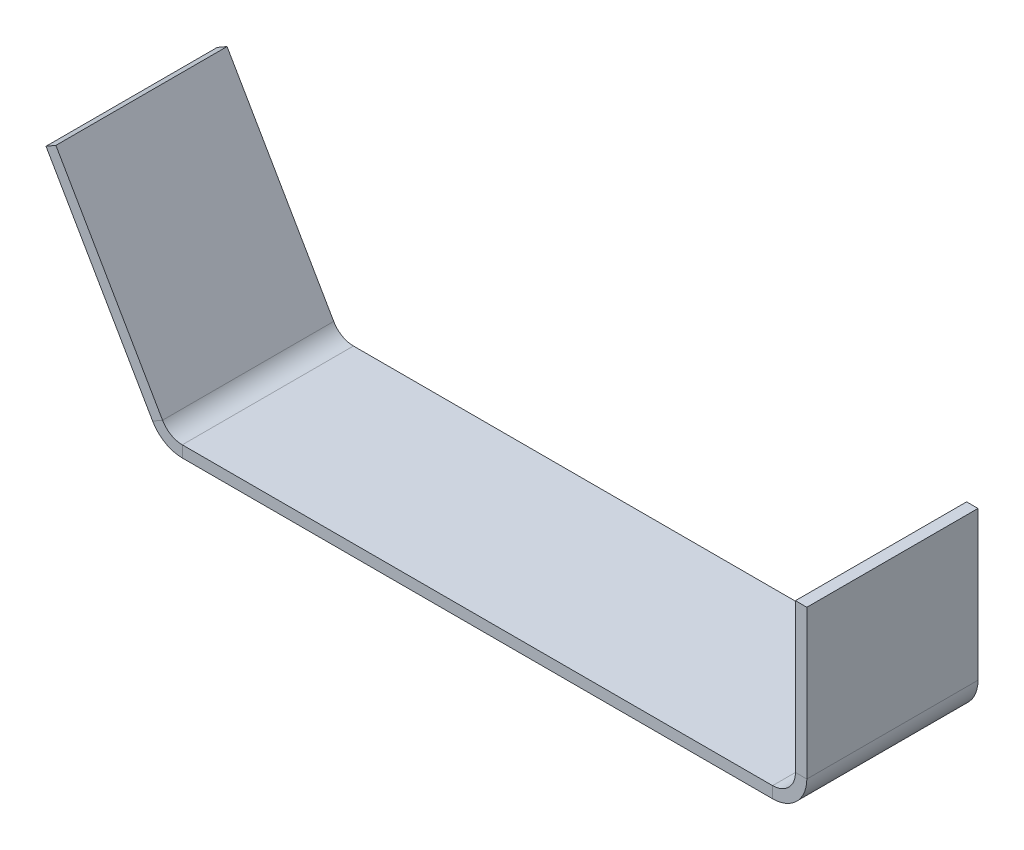
ISO-10303-21;
HEADER;
FILE_DESCRIPTION(('STEP AP214'),'2;1');
FILE_NAME('part.step','',(''),(''),'','','');
FILE_SCHEMA(('AUTOMOTIVE_DESIGN { 1 0 10303 214 1 1 1 1 }'));
ENDSEC;
DATA;
#1=APPLICATION_CONTEXT('core data for automotive mechanical design processes');
#2=APPLICATION_PROTOCOL_DEFINITION('international standard','automotive_design',2000,#1);
#3=PRODUCT_CONTEXT('',#1,'mechanical');
#4=PRODUCT('Part','Part','',(#3));
#5=PRODUCT_RELATED_PRODUCT_CATEGORY('part','',(#4));
#6=PRODUCT_DEFINITION_FORMATION('','',#4);
#7=PRODUCT_DEFINITION_CONTEXT('part definition',#1,'design');
#8=PRODUCT_DEFINITION('design','',#6,#7);
#9=PRODUCT_DEFINITION_SHAPE('','',#8);
#10=(LENGTH_UNIT() NAMED_UNIT(*) SI_UNIT(.MILLI.,.METRE.));
#11=(NAMED_UNIT(*) PLANE_ANGLE_UNIT() SI_UNIT($,.RADIAN.));
#12=(NAMED_UNIT(*) SI_UNIT($,.STERADIAN.) SOLID_ANGLE_UNIT());
#13=UNCERTAINTY_MEASURE_WITH_UNIT(LENGTH_MEASURE(1.E-05),#10,'distance_accuracy_value','');
#14=(GEOMETRIC_REPRESENTATION_CONTEXT(3) GLOBAL_UNCERTAINTY_ASSIGNED_CONTEXT((#13)) GLOBAL_UNIT_ASSIGNED_CONTEXT((#10,
#11,#12)) REPRESENTATION_CONTEXT('',''));
#15=CARTESIAN_POINT('',(0.,0.,0.));
#16=DIRECTION('',(0.,0.,1.));
#17=DIRECTION('',(1.,0.,0.));
#18=AXIS2_PLACEMENT_3D('',#15,#16,#17);
#19=CARTESIAN_POINT('',(0.,1.,0.));
#20=DIRECTION('',(0.,1.,0.));
#21=DIRECTION('',(0.,0.,1.));
#22=AXIS2_PLACEMENT_3D('',#19,#20,#21);
#23=PLANE('',#22);
#24=DIRECTION('',(1.,0.,0.));
#25=VECTOR('',#24,1.);
#26=CARTESIAN_POINT('',(-45.,1.,7.5));
#27=LINE('',#26,#25);
#28=CARTESIAN_POINT('',(-23.6910030610043,1.,7.5));
#29=VERTEX_POINT('',#28);
#30=CARTESIAN_POINT('',(28.0365045915063,1.,7.5));
#31=VERTEX_POINT('',#30);
#32=EDGE_CURVE('E53',#29,#31,#27,.T.);
#33=ORIENTED_EDGE('',*,*,#32,.T.);
#34=DIRECTION('',(0.,0.,-1.));
#35=VECTOR('',#34,1.);
#36=CARTESIAN_POINT('',(28.0365045915064,1.,0.));
#37=LINE('',#36,#35);
#38=CARTESIAN_POINT('',(28.0365045915063,1.,-7.5));
#39=VERTEX_POINT('',#38);
#40=EDGE_CURVE('E241',#31,#39,#37,.T.);
#41=ORIENTED_EDGE('',*,*,#40,.T.);
#42=DIRECTION('',(-1.,0.,0.));
#43=VECTOR('',#42,1.);
#44=CARTESIAN_POINT('',(-45.,1.,-7.5));
#45=LINE('',#44,#43);
#46=CARTESIAN_POINT('',(-23.6910030610042,1.,-7.5));
#47=VERTEX_POINT('',#46);
#48=EDGE_CURVE('E215',#39,#47,#45,.T.);
#49=ORIENTED_EDGE('',*,*,#48,.T.);
#50=DIRECTION('',(0.,0.,-1.));
#51=VECTOR('',#50,1.);
#52=CARTESIAN_POINT('',(-23.6910030610042,1.,0.));
#53=LINE('',#52,#51);
#54=EDGE_CURVE('E203',#29,#47,#53,.T.);
#55=ORIENTED_EDGE('',*,*,#54,.F.);
#56=EDGE_LOOP('',(#33,#41,#49,#55));
#57=FACE_BOUND('',#56,.T.);
#58=ADVANCED_FACE('F49',(#57),#23,.T.);
#59=CARTESIAN_POINT('',(-12.2685553990753,-20.7842596972574,0.));
#60=DIRECTION('',(0.86602540378444,0.499999999999998,0.));
#61=DIRECTION('',(0.,0.,1.));
#62=AXIS2_PLACEMENT_3D('',#59,#60,#61);
#63=PLANE('',#62);
#64=DIRECTION('',(0.499999999999998,-0.86602540378444,0.));
#65=VECTOR('',#64,1.);
#66=CARTESIAN_POINT('',(-34.7685553990752,18.1868834730424,7.5));
#67=LINE('',#66,#65);
#68=CARTESIAN_POINT('',(-34.7685553990752,18.1868834730424,7.5));
#69=VERTEX_POINT('',#68);
#70=CARTESIAN_POINT('',(-25.4230538685731,2.00000000000001,7.5));
#71=VERTEX_POINT('',#70);
#72=EDGE_CURVE('E220',#69,#71,#67,.T.);
#73=ORIENTED_EDGE('',*,*,#72,.T.);
#74=DIRECTION('',(0.,0.,-1.));
#75=VECTOR('',#74,1.);
#76=CARTESIAN_POINT('',(-25.4230538685731,2.,0.));
#77=LINE('',#76,#75);
#78=CARTESIAN_POINT('',(-25.4230538685731,2.00000000000001,-7.5));
#79=VERTEX_POINT('',#78);
#80=EDGE_CURVE('E231',#71,#79,#77,.T.);
#81=ORIENTED_EDGE('',*,*,#80,.T.);
#82=DIRECTION('',(-0.499999999999998,0.86602540378444,0.));
#83=VECTOR('',#82,1.);
#84=CARTESIAN_POINT('',(-34.7685553990752,18.1868834730424,-7.5));
#85=LINE('',#84,#83);
#86=CARTESIAN_POINT('',(-34.7685553990752,18.1868834730424,-7.5));
#87=VERTEX_POINT('',#86);
#88=EDGE_CURVE('E221',#79,#87,#85,.T.);
#89=ORIENTED_EDGE('',*,*,#88,.T.);
#90=DIRECTION('',(0.,0.,1.));
#91=VECTOR('',#90,1.);
#92=CARTESIAN_POINT('',(-34.7685553990752,18.1868834730424,-7.5));
#93=LINE('',#92,#91);
#94=EDGE_CURVE('E218',#87,#69,#93,.T.);
#95=ORIENTED_EDGE('',*,*,#94,.T.);
#96=EDGE_LOOP('',(#73,#81,#89,#95));
#97=FACE_BOUND('',#96,.T.);
#98=ADVANCED_FACE('F292',(#97),#63,.T.);
#99=CARTESIAN_POINT('',(-34.7685553990752,18.1868834730424,-7.5));
#100=DIRECTION('',(0.,0.,1.));
#101=DIRECTION('',(0.499999999999998,-0.86602540378444,0.));
#102=AXIS2_PLACEMENT_3D('',#99,#100,#101);
#103=PLANE('',#102);
#104=DIRECTION('',(0.86602540378444,0.499999999999998,0.));
#105=VECTOR('',#104,1.);
#106=CARTESIAN_POINT('',(-25.4230538685731,2.,-7.5));
#107=LINE('',#106,#105);
#108=CARTESIAN_POINT('',(-26.2890792723576,1.50000000000001,-7.5));
#109=VERTEX_POINT('',#108);
#110=EDGE_CURVE('E238',#109,#79,#107,.T.);
#111=ORIENTED_EDGE('',*,*,#110,.F.);
#112=DIRECTION('',(-0.499999999999998,0.86602540378444,0.));
#113=VECTOR('',#112,1.);
#114=CARTESIAN_POINT('',(-35.6345808028597,17.6868834730424,-7.5));
#115=LINE('',#114,#113);
#116=CARTESIAN_POINT('',(-35.6345808028597,17.6868834730424,-7.5));
#117=VERTEX_POINT('',#116);
#118=EDGE_CURVE('E210',#109,#117,#115,.T.);
#119=ORIENTED_EDGE('',*,*,#118,.T.);
#120=DIRECTION('',(-0.86602540378444,-0.499999999999998,0.));
#121=VECTOR('',#120,1.);
#122=CARTESIAN_POINT('',(-34.7685553990752,18.1868834730424,-7.5));
#123=LINE('',#122,#121);
#124=EDGE_CURVE('E228',#87,#117,#123,.T.);
#125=ORIENTED_EDGE('',*,*,#124,.F.);
#126=ORIENTED_EDGE('',*,*,#88,.F.);
#127=EDGE_LOOP('',(#111,#119,#125,#126));
#128=FACE_BOUND('',#127,.T.);
#129=ADVANCED_FACE('F298',(#128),#103,.F.);
#130=CARTESIAN_POINT('',(-34.7685553990752,18.1868834730424,-7.5));
#131=DIRECTION('',(0.499999999999998,-0.86602540378444,0.));
#132=DIRECTION('',(0.,0.,-1.));
#133=AXIS2_PLACEMENT_3D('',#130,#131,#132);
#134=PLANE('',#133);
#135=DIRECTION('',(0.,0.,1.));
#136=VECTOR('',#135,1.);
#137=CARTESIAN_POINT('',(-35.6345808028597,17.6868834730424,-7.5));
#138=LINE('',#137,#136);
#139=CARTESIAN_POINT('',(-35.6345808028597,17.6868834730424,7.5));
#140=VERTEX_POINT('',#139);
#141=EDGE_CURVE('E222',#117,#140,#138,.T.);
#142=ORIENTED_EDGE('',*,*,#141,.T.);
#143=DIRECTION('',(-0.86602540378444,-0.499999999999998,0.));
#144=VECTOR('',#143,1.);
#145=CARTESIAN_POINT('',(-34.7685553990752,18.1868834730424,7.5));
#146=LINE('',#145,#144);
#147=EDGE_CURVE('E225',#69,#140,#146,.T.);
#148=ORIENTED_EDGE('',*,*,#147,.F.);
#149=ORIENTED_EDGE('',*,*,#94,.F.);
#150=ORIENTED_EDGE('',*,*,#124,.T.);
#151=EDGE_LOOP('',(#142,#148,#149,#150));
#152=FACE_BOUND('',#151,.T.);
#153=ADVANCED_FACE('F304',(#152),#134,.F.);
#154=CARTESIAN_POINT('',(-34.7685553990752,18.1868834730424,7.5));
#155=DIRECTION('',(0.,0.,-1.));
#156=DIRECTION('',(-0.499999999999998,0.86602540378444,0.));
#157=AXIS2_PLACEMENT_3D('',#154,#155,#156);
#158=PLANE('',#157);
#159=DIRECTION('',(-0.86602540378444,-0.499999999999998,0.));
#160=VECTOR('',#159,1.);
#161=CARTESIAN_POINT('',(-25.4230538685731,2.,7.5));
#162=LINE('',#161,#160);
#163=CARTESIAN_POINT('',(-26.2890792723576,1.50000000000001,7.5));
#164=VERTEX_POINT('',#163);
#165=EDGE_CURVE('E234',#71,#164,#162,.T.);
#166=ORIENTED_EDGE('',*,*,#165,.F.);
#167=ORIENTED_EDGE('',*,*,#72,.F.);
#168=ORIENTED_EDGE('',*,*,#147,.T.);
#169=DIRECTION('',(0.499999999999998,-0.86602540378444,0.));
#170=VECTOR('',#169,1.);
#171=CARTESIAN_POINT('',(-35.6345808028597,17.6868834730424,7.5));
#172=LINE('',#171,#170);
#173=EDGE_CURVE('E224',#140,#164,#172,.T.);
#174=ORIENTED_EDGE('',*,*,#173,.T.);
#175=EDGE_LOOP('',(#166,#167,#168,#174));
#176=FACE_BOUND('',#175,.T.);
#177=ADVANCED_FACE('F307',(#176),#158,.F.);
#178=CARTESIAN_POINT('',(-13.1345808028597,-21.2842596972574,0.));
#179=DIRECTION('',(0.86602540378444,0.499999999999998,0.));
#180=DIRECTION('',(0.,0.,1.));
#181=AXIS2_PLACEMENT_3D('',#178,#179,#180);
#182=PLANE('',#181);
#183=DIRECTION('',(0.,0.,-1.));
#184=VECTOR('',#183,1.);
#185=CARTESIAN_POINT('',(-26.2890792723576,1.5,0.));
#186=LINE('',#185,#184);
#187=EDGE_CURVE('E236',#164,#109,#186,.T.);
#188=ORIENTED_EDGE('',*,*,#187,.F.);
#189=ORIENTED_EDGE('',*,*,#173,.F.);
#190=ORIENTED_EDGE('',*,*,#141,.F.);
#191=ORIENTED_EDGE('',*,*,#118,.F.);
#192=EDGE_LOOP('',(#188,#189,#190,#191));
#193=FACE_BOUND('',#192,.T.);
#194=ADVANCED_FACE('F315',(#193),#182,.F.);
#195=CARTESIAN_POINT('',(-45.,1.,7.5));
#196=DIRECTION('',(0.,0.,-1.));
#197=DIRECTION('',(-1.,0.,0.));
#198=AXIS2_PLACEMENT_3D('',#195,#196,#197);
#199=PLANE('',#198);
#200=DIRECTION('',(0.,-1.,0.));
#201=VECTOR('',#200,1.);
#202=CARTESIAN_POINT('',(28.0365045915064,1.,7.5));
#203=LINE('',#202,#201);
#204=CARTESIAN_POINT('',(28.0365045915063,0.,7.5));
#205=VERTEX_POINT('',#204);
#206=EDGE_CURVE('E250',#31,#205,#203,.T.);
#207=ORIENTED_EDGE('',*,*,#206,.F.);
#208=ORIENTED_EDGE('',*,*,#32,.F.);
#209=DIRECTION('',(0.,-1.,0.));
#210=VECTOR('',#209,1.);
#211=CARTESIAN_POINT('',(-23.6910030610042,1.,7.5));
#212=LINE('',#211,#210);
#213=CARTESIAN_POINT('',(-23.6910030610043,0.,7.5));
#214=VERTEX_POINT('',#213);
#215=EDGE_CURVE('E213',#29,#214,#212,.T.);
#216=ORIENTED_EDGE('',*,*,#215,.T.);
#217=DIRECTION('',(1.,0.,0.));
#218=VECTOR('',#217,1.);
#219=CARTESIAN_POINT('',(-45.,0.,7.5));
#220=LINE('',#219,#218);
#221=EDGE_CURVE('E74',#214,#205,#220,.T.);
#222=ORIENTED_EDGE('',*,*,#221,.T.);
#223=EDGE_LOOP('',(#207,#208,#216,#222));
#224=FACE_BOUND('',#223,.T.);
#225=ADVANCED_FACE('F260',(#224),#199,.F.);
#226=CARTESIAN_POINT('',(0.,0.,0.));
#227=DIRECTION('',(0.,1.,0.));
#228=DIRECTION('',(0.,0.,1.));
#229=AXIS2_PLACEMENT_3D('',#226,#227,#228);
#230=PLANE('',#229);
#231=DIRECTION('',(0.,0.,-1.));
#232=VECTOR('',#231,1.);
#233=CARTESIAN_POINT('',(28.0365045915064,0.,0.));
#234=LINE('',#233,#232);
#235=CARTESIAN_POINT('',(28.0365045915063,0.,-7.5));
#236=VERTEX_POINT('',#235);
#237=EDGE_CURVE('E58',#205,#236,#234,.T.);
#238=ORIENTED_EDGE('',*,*,#237,.F.);
#239=ORIENTED_EDGE('',*,*,#221,.F.);
#240=DIRECTION('',(0.,0.,-1.));
#241=VECTOR('',#240,1.);
#242=CARTESIAN_POINT('',(-23.6910030610042,0.,0.));
#243=LINE('',#242,#241);
#244=CARTESIAN_POINT('',(-23.6910030610043,0.,-7.5));
#245=VERTEX_POINT('',#244);
#246=EDGE_CURVE('E211',#214,#245,#243,.T.);
#247=ORIENTED_EDGE('',*,*,#246,.T.);
#248=DIRECTION('',(-1.,0.,0.));
#249=VECTOR('',#248,1.);
#250=CARTESIAN_POINT('',(-45.,0.,-7.5));
#251=LINE('',#250,#249);
#252=EDGE_CURVE('E66',#236,#245,#251,.T.);
#253=ORIENTED_EDGE('',*,*,#252,.F.);
#254=EDGE_LOOP('',(#238,#239,#247,#253));
#255=FACE_BOUND('',#254,.T.);
#256=ADVANCED_FACE('F281',(#255),#230,.F.);
#257=CARTESIAN_POINT('',(-45.,1.,-7.5));
#258=DIRECTION('',(0.,0.,1.));
#259=DIRECTION('',(1.,0.,0.));
#260=AXIS2_PLACEMENT_3D('',#257,#258,#259);
#261=PLANE('',#260);
#262=DIRECTION('',(0.,1.,0.));
#263=VECTOR('',#262,1.);
#264=CARTESIAN_POINT('',(28.0365045915064,1.,-7.5));
#265=LINE('',#264,#263);
#266=EDGE_CURVE('E12',#236,#39,#265,.T.);
#267=ORIENTED_EDGE('',*,*,#266,.F.);
#268=ORIENTED_EDGE('',*,*,#252,.T.);
#269=DIRECTION('',(0.,1.,0.));
#270=VECTOR('',#269,1.);
#271=CARTESIAN_POINT('',(-23.6910030610042,1.,-7.5));
#272=LINE('',#271,#270);
#273=EDGE_CURVE('E207',#245,#47,#272,.T.);
#274=ORIENTED_EDGE('',*,*,#273,.T.);
#275=ORIENTED_EDGE('',*,*,#48,.F.);
#276=EDGE_LOOP('',(#267,#268,#274,#275));
#277=FACE_BOUND('',#276,.T.);
#278=ADVANCED_FACE('F51',(#277),#261,.F.);
#279=CARTESIAN_POINT('',(-23.6910030610042,3.,7.5));
#280=DIRECTION('',(0.,0.,-1.));
#281=DIRECTION('',(-1.,0.,0.));
#282=AXIS2_PLACEMENT_3D('',#279,#280,#281);
#283=PLANE('',#282);
#284=ORIENTED_EDGE('',*,*,#165,.T.);
#285=CARTESIAN_POINT('',(-23.6910030610042,3.,7.5));
#286=DIRECTION('',(0.,0.,1.));
#287=DIRECTION('',(1.,0.,0.));
#288=AXIS2_PLACEMENT_3D('',#285,#286,#287);
#289=CIRCLE('',#288,3.);
#290=EDGE_CURVE('E193',#164,#214,#289,.T.);
#291=ORIENTED_EDGE('',*,*,#290,.T.);
#292=ORIENTED_EDGE('',*,*,#215,.F.);
#293=CARTESIAN_POINT('',(-23.6910030610042,3.,7.5));
#294=DIRECTION('',(0.,0.,1.));
#295=DIRECTION('',(1.,0.,0.));
#296=AXIS2_PLACEMENT_3D('',#293,#294,#295);
#297=CIRCLE('',#296,2.);
#298=EDGE_CURVE('E197',#71,#29,#297,.T.);
#299=ORIENTED_EDGE('',*,*,#298,.F.);
#300=EDGE_LOOP('',(#284,#291,#292,#299));
#301=FACE_BOUND('',#300,.T.);
#302=ADVANCED_FACE('F285',(#301),#283,.F.);
#303=CARTESIAN_POINT('',(-23.6910030610042,3.,-7.5));
#304=DIRECTION('',(0.,0.,1.));
#305=DIRECTION('',(1.,0.,0.));
#306=AXIS2_PLACEMENT_3D('',#303,#304,#305);
#307=PLANE('',#306);
#308=CARTESIAN_POINT('',(-23.6910030610042,3.,-7.5));
#309=DIRECTION('',(0.,0.,1.));
#310=DIRECTION('',(1.,0.,0.));
#311=AXIS2_PLACEMENT_3D('',#308,#309,#310);
#312=CIRCLE('',#311,3.);
#313=EDGE_CURVE('E201',#245,#109,#312,.F.);
#314=ORIENTED_EDGE('',*,*,#313,.T.);
#315=ORIENTED_EDGE('',*,*,#110,.T.);
#316=CARTESIAN_POINT('',(-23.6910030610042,3.,-7.5));
#317=DIRECTION('',(0.,0.,-1.));
#318=DIRECTION('',(-1.,0.,0.));
#319=AXIS2_PLACEMENT_3D('',#316,#317,#318);
#320=CIRCLE('',#319,2.);
#321=EDGE_CURVE('E200',#47,#79,#320,.T.);
#322=ORIENTED_EDGE('',*,*,#321,.F.);
#323=ORIENTED_EDGE('',*,*,#273,.F.);
#324=EDGE_LOOP('',(#314,#315,#322,#323));
#325=FACE_BOUND('',#324,.T.);
#326=ADVANCED_FACE('F313',(#325),#307,.F.);
#327=CARTESIAN_POINT('',(-23.6910030610042,3.,-15.2595508434947));
#328=DIRECTION('',(0.,0.,1.));
#329=DIRECTION('',(1.,0.,0.));
#330=AXIS2_PLACEMENT_3D('',#327,#328,#329);
#331=CYLINDRICAL_SURFACE('',#330,2.);
#332=ORIENTED_EDGE('',*,*,#54,.T.);
#333=ORIENTED_EDGE('',*,*,#321,.T.);
#334=ORIENTED_EDGE('',*,*,#80,.F.);
#335=ORIENTED_EDGE('',*,*,#298,.T.);
#336=EDGE_LOOP('',(#332,#333,#334,#335));
#337=FACE_BOUND('',#336,.T.);
#338=ADVANCED_FACE('F288',(#337),#331,.F.);
#339=CARTESIAN_POINT('',(-23.6910030610042,3.,-15.2595508434947));
#340=DIRECTION('',(0.,0.,1.));
#341=DIRECTION('',(1.,0.,0.));
#342=AXIS2_PLACEMENT_3D('',#339,#340,#341);
#343=CYLINDRICAL_SURFACE('',#342,3.);
#344=ORIENTED_EDGE('',*,*,#246,.F.);
#345=ORIENTED_EDGE('',*,*,#290,.F.);
#346=ORIENTED_EDGE('',*,*,#187,.T.);
#347=ORIENTED_EDGE('',*,*,#313,.F.);
#348=EDGE_LOOP('',(#344,#345,#346,#347));
#349=FACE_BOUND('',#348,.T.);
#350=ADVANCED_FACE('F310',(#349),#343,.T.);
#351=CARTESIAN_POINT('',(28.0365045915064,3.,7.5));
#352=DIRECTION('',(0.,0.,-1.));
#353=DIRECTION('',(-1.,0.,0.));
#354=AXIS2_PLACEMENT_3D('',#351,#352,#353);
#355=PLANE('',#354);
#356=ORIENTED_EDGE('',*,*,#206,.T.);
#357=CARTESIAN_POINT('',(28.0365045915064,3.,7.5));
#358=DIRECTION('',(0.,0.,-1.));
#359=DIRECTION('',(-1.,0.,0.));
#360=AXIS2_PLACEMENT_3D('',#357,#358,#359);
#361=CIRCLE('',#360,3.);
#362=CARTESIAN_POINT('',(31.0365045915063,3.00000000000001,7.5));
#363=VERTEX_POINT('',#362);
#364=EDGE_CURVE('E166',#205,#363,#361,.F.);
#365=ORIENTED_EDGE('',*,*,#364,.T.);
#366=DIRECTION('',(1.,0.,0.));
#367=VECTOR('',#366,1.);
#368=CARTESIAN_POINT('',(30.0365045915063,3.00000000000003,7.5));
#369=LINE('',#368,#367);
#370=CARTESIAN_POINT('',(30.0365045915063,3.00000000000001,7.5));
#371=VERTEX_POINT('',#370);
#372=EDGE_CURVE('E152',#371,#363,#369,.T.);
#373=ORIENTED_EDGE('',*,*,#372,.F.);
#374=CARTESIAN_POINT('',(28.0365045915064,3.,7.5));
#375=DIRECTION('',(0.,0.,1.));
#376=DIRECTION('',(1.,0.,0.));
#377=AXIS2_PLACEMENT_3D('',#374,#375,#376);
#378=CIRCLE('',#377,2.);
#379=EDGE_CURVE('E188',#31,#371,#378,.T.);
#380=ORIENTED_EDGE('',*,*,#379,.F.);
#381=EDGE_LOOP('',(#356,#365,#373,#380));
#382=FACE_BOUND('',#381,.T.);
#383=ADVANCED_FACE('F268',(#382),#355,.F.);
#384=CARTESIAN_POINT('',(28.0365045915064,3.,-7.5));
#385=DIRECTION('',(0.,0.,1.));
#386=DIRECTION('',(1.,0.,0.));
#387=AXIS2_PLACEMENT_3D('',#384,#385,#386);
#388=PLANE('',#387);
#389=CARTESIAN_POINT('',(28.0365045915064,3.,-7.5));
#390=DIRECTION('',(0.,0.,-1.));
#391=DIRECTION('',(-1.,0.,0.));
#392=AXIS2_PLACEMENT_3D('',#389,#390,#391);
#393=CIRCLE('',#392,3.);
#394=CARTESIAN_POINT('',(31.0365045915063,3.00000000000001,-7.5));
#395=VERTEX_POINT('',#394);
#396=EDGE_CURVE('E169',#395,#236,#393,.T.);
#397=ORIENTED_EDGE('',*,*,#396,.T.);
#398=ORIENTED_EDGE('',*,*,#266,.T.);
#399=CARTESIAN_POINT('',(28.0365045915064,3.,-7.5));
#400=DIRECTION('',(0.,0.,-1.));
#401=DIRECTION('',(-1.,0.,0.));
#402=AXIS2_PLACEMENT_3D('',#399,#400,#401);
#403=CIRCLE('',#402,2.);
#404=CARTESIAN_POINT('',(30.0365045915064,3.,-7.5));
#405=VERTEX_POINT('',#404);
#406=EDGE_CURVE('E191',#405,#39,#403,.T.);
#407=ORIENTED_EDGE('',*,*,#406,.F.);
#408=DIRECTION('',(-1.,0.,0.));
#409=VECTOR('',#408,1.);
#410=CARTESIAN_POINT('',(30.0365045915063,3.00000000000003,-7.5));
#411=LINE('',#410,#409);
#412=EDGE_CURVE('E149',#395,#405,#411,.T.);
#413=ORIENTED_EDGE('',*,*,#412,.F.);
#414=EDGE_LOOP('',(#397,#398,#407,#413));
#415=FACE_BOUND('',#414,.T.);
#416=ADVANCED_FACE('F278',(#415),#388,.F.);
#417=CARTESIAN_POINT('',(28.0365045915064,3.,15.5377365429043));
#418=DIRECTION('',(0.,0.,-1.));
#419=DIRECTION('',(-1.,0.,0.));
#420=AXIS2_PLACEMENT_3D('',#417,#418,#419);
#421=CYLINDRICAL_SURFACE('',#420,2.);
#422=DIRECTION('',(0.,0.,-1.));
#423=VECTOR('',#422,1.);
#424=CARTESIAN_POINT('',(30.0365045915063,3.00000000000003,0.));
#425=LINE('',#424,#423);
#426=EDGE_CURVE('E186',#371,#405,#425,.T.);
#427=ORIENTED_EDGE('',*,*,#426,.T.);
#428=ORIENTED_EDGE('',*,*,#406,.T.);
#429=ORIENTED_EDGE('',*,*,#40,.F.);
#430=ORIENTED_EDGE('',*,*,#379,.T.);
#431=EDGE_LOOP('',(#427,#428,#429,#430));
#432=FACE_BOUND('',#431,.T.);
#433=ADVANCED_FACE('F265',(#432),#421,.F.);
#434=CARTESIAN_POINT('',(28.0365045915064,3.,15.5377365429043));
#435=DIRECTION('',(0.,0.,-1.));
#436=DIRECTION('',(-1.,0.,0.));
#437=AXIS2_PLACEMENT_3D('',#434,#435,#436);
#438=CYLINDRICAL_SURFACE('',#437,3.);
#439=DIRECTION('',(0.,0.,-1.));
#440=VECTOR('',#439,1.);
#441=CARTESIAN_POINT('',(31.0365045915063,3.00000000000004,0.));
#442=LINE('',#441,#440);
#443=EDGE_CURVE('E175',#363,#395,#442,.T.);
#444=ORIENTED_EDGE('',*,*,#443,.F.);
#445=ORIENTED_EDGE('',*,*,#364,.F.);
#446=ORIENTED_EDGE('',*,*,#237,.T.);
#447=ORIENTED_EDGE('',*,*,#396,.F.);
#448=EDGE_LOOP('',(#444,#445,#446,#447));
#449=FACE_BOUND('',#448,.T.);
#450=ADVANCED_FACE('F274',(#449),#438,.T.);
#451=CARTESIAN_POINT('',(30.0365045915063,16.0365045915064,-7.5));
#452=DIRECTION('',(0.,-1.,0.));
#453=DIRECTION('',(0.,0.,1.));
#454=AXIS2_PLACEMENT_3D('',#451,#452,#453);
#455=PLANE('',#454);
#456=DIRECTION('',(0.,0.,-1.));
#457=VECTOR('',#456,1.);
#458=CARTESIAN_POINT('',(31.0365045915063,16.0365045915064,-7.5));
#459=LINE('',#458,#457);
#460=CARTESIAN_POINT('',(31.0365045915063,16.0365045915064,7.5));
#461=VERTEX_POINT('',#460);
#462=CARTESIAN_POINT('',(31.0365045915063,16.0365045915064,-7.5));
#463=VERTEX_POINT('',#462);
#464=EDGE_CURVE('E165',#461,#463,#459,.T.);
#465=ORIENTED_EDGE('',*,*,#464,.T.);
#466=DIRECTION('',(1.,0.,0.));
#467=VECTOR('',#466,1.);
#468=CARTESIAN_POINT('',(30.0365045915063,16.0365045915064,-7.5));
#469=LINE('',#468,#467);
#470=CARTESIAN_POINT('',(30.0365045915063,16.0365045915064,-7.5));
#471=VERTEX_POINT('',#470);
#472=EDGE_CURVE('E146',#471,#463,#469,.T.);
#473=ORIENTED_EDGE('',*,*,#472,.F.);
#474=DIRECTION('',(0.,0.,-1.));
#475=VECTOR('',#474,1.);
#476=CARTESIAN_POINT('',(30.0365045915063,16.0365045915064,-7.5));
#477=LINE('',#476,#475);
#478=CARTESIAN_POINT('',(30.0365045915063,16.0365045915064,7.5));
#479=VERTEX_POINT('',#478);
#480=EDGE_CURVE('E153',#479,#471,#477,.T.);
#481=ORIENTED_EDGE('',*,*,#480,.F.);
#482=DIRECTION('',(1.,0.,0.));
#483=VECTOR('',#482,1.);
#484=CARTESIAN_POINT('',(30.0365045915063,16.0365045915064,7.5));
#485=LINE('',#484,#483);
#486=EDGE_CURVE('E183',#479,#461,#485,.T.);
#487=ORIENTED_EDGE('',*,*,#486,.T.);
#488=EDGE_LOOP('',(#465,#473,#481,#487));
#489=FACE_BOUND('',#488,.T.);
#490=ADVANCED_FACE('F163',(#489),#455,.F.);
#491=CARTESIAN_POINT('',(30.0365045915065,-28.9634954084936,0.));
#492=DIRECTION('',(-1.,0.,0.));
#493=DIRECTION('',(0.,0.,1.));
#494=AXIS2_PLACEMENT_3D('',#491,#492,#493);
#495=PLANE('',#494);
#496=ORIENTED_EDGE('',*,*,#426,.F.);
#497=DIRECTION('',(0.,1.,0.));
#498=VECTOR('',#497,1.);
#499=CARTESIAN_POINT('',(30.0365045915066,-73.9634954084936,7.5));
#500=LINE('',#499,#498);
#501=EDGE_CURVE('E158',#371,#479,#500,.T.);
#502=ORIENTED_EDGE('',*,*,#501,.T.);
#503=ORIENTED_EDGE('',*,*,#480,.T.);
#504=DIRECTION('',(0.,-1.,0.));
#505=VECTOR('',#504,1.);
#506=CARTESIAN_POINT('',(30.0365045915066,-73.9634954084936,-7.5));
#507=LINE('',#506,#505);
#508=EDGE_CURVE('E142',#471,#405,#507,.T.);
#509=ORIENTED_EDGE('',*,*,#508,.T.);
#510=EDGE_LOOP('',(#496,#502,#503,#509));
#511=FACE_BOUND('',#510,.T.);
#512=ADVANCED_FACE('F156',(#511),#495,.T.);
#513=CARTESIAN_POINT('',(30.0365045915066,-73.9634954084936,7.5));
#514=DIRECTION('',(0.,0.,-1.));
#515=DIRECTION('',(0.,-1.,0.));
#516=AXIS2_PLACEMENT_3D('',#513,#514,#515);
#517=PLANE('',#516);
#518=ORIENTED_EDGE('',*,*,#501,.F.);
#519=ORIENTED_EDGE('',*,*,#372,.T.);
#520=DIRECTION('',(0.,1.,0.));
#521=VECTOR('',#520,1.);
#522=CARTESIAN_POINT('',(31.0365045915066,-73.9634954084936,7.5));
#523=LINE('',#522,#521);
#524=EDGE_CURVE('E178',#363,#461,#523,.T.);
#525=ORIENTED_EDGE('',*,*,#524,.T.);
#526=ORIENTED_EDGE('',*,*,#486,.F.);
#527=EDGE_LOOP('',(#518,#519,#525,#526));
#528=FACE_BOUND('',#527,.T.);
#529=ADVANCED_FACE('F271',(#528),#517,.F.);
#530=CARTESIAN_POINT('',(31.0365045915065,-28.9634954084936,0.));
#531=DIRECTION('',(-1.,0.,0.));
#532=DIRECTION('',(0.,0.,1.));
#533=AXIS2_PLACEMENT_3D('',#530,#531,#532);
#534=PLANE('',#533);
#535=ORIENTED_EDGE('',*,*,#524,.F.);
#536=ORIENTED_EDGE('',*,*,#443,.T.);
#537=DIRECTION('',(0.,-1.,0.));
#538=VECTOR('',#537,1.);
#539=CARTESIAN_POINT('',(31.0365045915066,-73.9634954084936,-7.5));
#540=LINE('',#539,#538);
#541=EDGE_CURVE('E171',#463,#395,#540,.T.);
#542=ORIENTED_EDGE('',*,*,#541,.F.);
#543=ORIENTED_EDGE('',*,*,#464,.F.);
#544=EDGE_LOOP('',(#535,#536,#542,#543));
#545=FACE_BOUND('',#544,.T.);
#546=ADVANCED_FACE('F276',(#545),#534,.F.);
#547=CARTESIAN_POINT('',(30.0365045915066,-73.9634954084936,-7.5));
#548=DIRECTION('',(0.,0.,1.));
#549=DIRECTION('',(0.,1.,0.));
#550=AXIS2_PLACEMENT_3D('',#547,#548,#549);
#551=PLANE('',#550);
#552=ORIENTED_EDGE('',*,*,#541,.T.);
#553=ORIENTED_EDGE('',*,*,#412,.T.);
#554=ORIENTED_EDGE('',*,*,#508,.F.);
#555=ORIENTED_EDGE('',*,*,#472,.T.);
#556=EDGE_LOOP('',(#552,#553,#554,#555));
#557=FACE_BOUND('',#556,.T.);
#558=ADVANCED_FACE('F144',(#557),#551,.F.);
#559=CLOSED_SHELL('',(#58,#98,#129,#153,#177,#194,#225,#256,#278,#302,#326,#338,#350,#383,#416,
#433,#450,#490,#512,#529,#546,#558));
#560=MANIFOLD_SOLID_BREP('B2',#559);
#561=ADVANCED_BREP_SHAPE_REPRESENTATION('',(#18,#560),#14);
#562=SHAPE_DEFINITION_REPRESENTATION(#9,#561);
ENDSEC;
END-ISO-10303-21;
